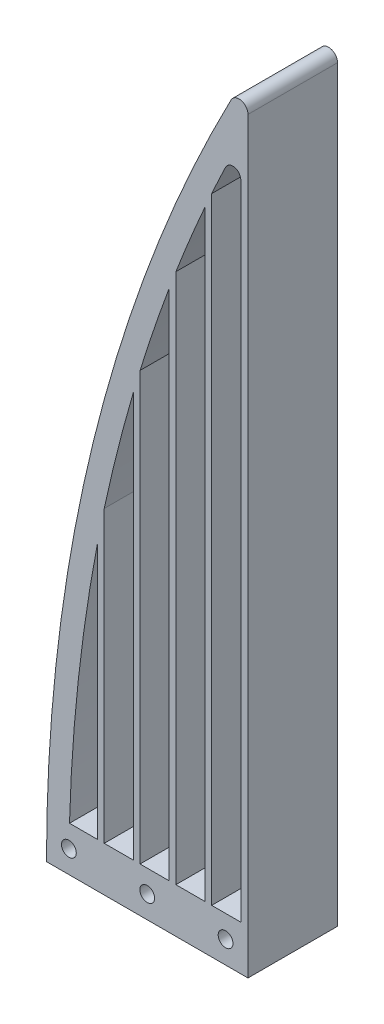
ISO-10303-21;
HEADER;
FILE_DESCRIPTION(('STEP AP214'),'2;1');
FILE_NAME('part.step','',(''),(''),'','','');
FILE_SCHEMA(('AUTOMOTIVE_DESIGN { 1 0 10303 214 1 1 1 1 }'));
ENDSEC;
DATA;
#1=APPLICATION_CONTEXT('core data for automotive mechanical design processes');
#2=APPLICATION_PROTOCOL_DEFINITION('international standard','automotive_design',2000,#1);
#3=PRODUCT_CONTEXT('',#1,'mechanical');
#4=PRODUCT('Part','Part','',(#3));
#5=PRODUCT_RELATED_PRODUCT_CATEGORY('part','',(#4));
#6=PRODUCT_DEFINITION_FORMATION('','',#4);
#7=PRODUCT_DEFINITION_CONTEXT('part definition',#1,'design');
#8=PRODUCT_DEFINITION('design','',#6,#7);
#9=PRODUCT_DEFINITION_SHAPE('','',#8);
#10=(LENGTH_UNIT() NAMED_UNIT(*) SI_UNIT(.MILLI.,.METRE.));
#11=(NAMED_UNIT(*) PLANE_ANGLE_UNIT() SI_UNIT($,.RADIAN.));
#12=(NAMED_UNIT(*) SI_UNIT($,.STERADIAN.) SOLID_ANGLE_UNIT());
#13=UNCERTAINTY_MEASURE_WITH_UNIT(LENGTH_MEASURE(1.E-05),#10,'distance_accuracy_value','');
#14=(GEOMETRIC_REPRESENTATION_CONTEXT(3) GLOBAL_UNCERTAINTY_ASSIGNED_CONTEXT((#13)) GLOBAL_UNIT_ASSIGNED_CONTEXT((#10,
#11,#12)) REPRESENTATION_CONTEXT('',''));
#15=CARTESIAN_POINT('',(0.,0.,0.));
#16=DIRECTION('',(0.,0.,1.));
#17=DIRECTION('',(1.,0.,0.));
#18=AXIS2_PLACEMENT_3D('',#15,#16,#17);
#19=CARTESIAN_POINT('',(317.777777777774,0.,20.));
#20=DIRECTION('',(0.,0.,1.));
#21=DIRECTION('',(1.,0.,0.));
#22=AXIS2_PLACEMENT_3D('',#19,#20,#21);
#23=PLANE('',#22);
#24=CARTESIAN_POINT('',(317.777777777774,0.,20.));
#25=DIRECTION('',(0.,0.,1.));
#26=DIRECTION('',(1.,0.,0.));
#27=AXIS2_PLACEMENT_3D('',#24,#25,#26);
#28=CIRCLE('',#27,357.777777777774);
#29=CARTESIAN_POINT('',(-33.6,67.3690994117891,20.));
#30=VERTEX_POINT('',#29);
#31=CARTESIAN_POINT('',(-39.8602211423662,10.,20.));
#32=VERTEX_POINT('',#31);
#33=EDGE_CURVE('E333',#30,#32,#28,.T.);
#34=ORIENTED_EDGE('',*,*,#33,.F.);
#35=DIRECTION('',(0.,-1.,0.));
#36=VECTOR('',#35,1.);
#37=CARTESIAN_POINT('',(-33.6,158.564445620495,20.));
#38=LINE('',#37,#36);
#39=CARTESIAN_POINT('',(-33.6,10.,20.));
#40=VERTEX_POINT('',#39);
#41=EDGE_CURVE('E230',#30,#40,#38,.T.);
#42=ORIENTED_EDGE('',*,*,#41,.T.);
#43=DIRECTION('',(1.,0.,0.));
#44=VECTOR('',#43,1.);
#45=CARTESIAN_POINT('',(-1.6,10.,20.));
#46=LINE('',#45,#44);
#47=EDGE_CURVE('E215',#32,#40,#46,.T.);
#48=ORIENTED_EDGE('',*,*,#47,.F.);
#49=EDGE_LOOP('',(#34,#42,#48));
#50=FACE_BOUND('',#49,.T.);
#51=DIRECTION('',(0.,1.,0.));
#52=VECTOR('',#51,1.);
#53=CARTESIAN_POINT('',(-32.1,158.564445620495,20.));
#54=LINE('',#53,#52);
#55=CARTESIAN_POINT('',(-32.1,10.,20.));
#56=VERTEX_POINT('',#55);
#57=CARTESIAN_POINT('',(-32.1,74.7695050731834,20.));
#58=VERTEX_POINT('',#57);
#59=EDGE_CURVE('E209',#56,#58,#54,.T.);
#60=ORIENTED_EDGE('',*,*,#59,.T.);
#61=CARTESIAN_POINT('',(-25.6,100.482038195888,20.));
#62=VERTEX_POINT('',#61);
#63=EDGE_CURVE('E543',#62,#58,#28,.T.);
#64=ORIENTED_EDGE('',*,*,#63,.F.);
#65=DIRECTION('',(0.,-1.,0.));
#66=VECTOR('',#65,1.);
#67=CARTESIAN_POINT('',(-25.6,158.564445620495,20.));
#68=LINE('',#67,#66);
#69=CARTESIAN_POINT('',(-25.6,10.,20.));
#70=VERTEX_POINT('',#69);
#71=EDGE_CURVE('E211',#62,#70,#68,.T.);
#72=ORIENTED_EDGE('',*,*,#71,.T.);
#73=EDGE_CURVE('E205',#56,#70,#46,.T.);
#74=ORIENTED_EDGE('',*,*,#73,.F.);
#75=EDGE_LOOP('',(#60,#64,#72,#74));
#76=FACE_BOUND('',#75,.T.);
#77=DIRECTION('',(0.,1.,0.));
#78=VECTOR('',#77,1.);
#79=CARTESIAN_POINT('',(-24.1,158.564445620495,20.));
#80=LINE('',#79,#78);
#81=CARTESIAN_POINT('',(-24.1,10.,20.));
#82=VERTEX_POINT('',#81);
#83=CARTESIAN_POINT('',(-24.1,105.472855907732,20.));
#84=VERTEX_POINT('',#83);
#85=EDGE_CURVE('E247',#82,#84,#80,.T.);
#86=ORIENTED_EDGE('',*,*,#85,.T.);
#87=CARTESIAN_POINT('',(-17.6,124.606117203146,20.));
#88=VERTEX_POINT('',#87);
#89=EDGE_CURVE('E522',#88,#84,#28,.T.);
#90=ORIENTED_EDGE('',*,*,#89,.F.);
#91=DIRECTION('',(0.,-1.,0.));
#92=VECTOR('',#91,1.);
#93=CARTESIAN_POINT('',(-17.6,158.564445620495,20.));
#94=LINE('',#93,#92);
#95=CARTESIAN_POINT('',(-17.6,10.,20.));
#96=VERTEX_POINT('',#95);
#97=EDGE_CURVE('E264',#88,#96,#94,.T.);
#98=ORIENTED_EDGE('',*,*,#97,.T.);
#99=EDGE_CURVE('E216',#82,#96,#46,.T.);
#100=ORIENTED_EDGE('',*,*,#99,.F.);
#101=EDGE_LOOP('',(#86,#90,#98,#100));
#102=FACE_BOUND('',#101,.T.);
#103=DIRECTION('',(0.,1.,0.));
#104=VECTOR('',#103,1.);
#105=CARTESIAN_POINT('',(-16.1,158.564445620495,20.));
#106=LINE('',#105,#104);
#107=CARTESIAN_POINT('',(-16.1,10.,20.));
#108=VERTEX_POINT('',#107);
#109=CARTESIAN_POINT('',(-16.1,128.571255643622,20.));
#110=VERTEX_POINT('',#109);
#111=EDGE_CURVE('E269',#108,#110,#106,.T.);
#112=ORIENTED_EDGE('',*,*,#111,.T.);
#113=CARTESIAN_POINT('',(-9.6,144.321616152566,20.));
#114=VERTEX_POINT('',#113);
#115=EDGE_CURVE('E337',#114,#110,#28,.T.);
#116=ORIENTED_EDGE('',*,*,#115,.F.);
#117=DIRECTION('',(0.,-1.,0.));
#118=VECTOR('',#117,1.);
#119=CARTESIAN_POINT('',(-9.59999999999999,158.564445620495,20.));
#120=LINE('',#119,#118);
#121=CARTESIAN_POINT('',(-9.59999999999999,10.,20.));
#122=VERTEX_POINT('',#121);
#123=EDGE_CURVE('E288',#114,#122,#120,.T.);
#124=ORIENTED_EDGE('',*,*,#123,.T.);
#125=EDGE_CURVE('E525',#108,#122,#46,.T.);
#126=ORIENTED_EDGE('',*,*,#125,.F.);
#127=EDGE_LOOP('',(#112,#116,#124,#126));
#128=FACE_BOUND('',#127,.T.);
#129=DIRECTION('',(0.,1.,0.));
#130=VECTOR('',#129,1.);
#131=CARTESIAN_POINT('',(-8.09999999999999,158.564445620495,20.));
#132=LINE('',#131,#130);
#133=CARTESIAN_POINT('',(-8.09999999999999,10.,20.));
#134=VERTEX_POINT('',#133);
#135=CARTESIAN_POINT('',(-8.1,147.677392386993,20.));
#136=VERTEX_POINT('',#135);
#137=EDGE_CURVE('E293',#134,#136,#132,.T.);
#138=ORIENTED_EDGE('',*,*,#137,.T.);
#139=CARTESIAN_POINT('',(-5.,154.335493145433,20.));
#140=VERTEX_POINT('',#139);
#141=EDGE_CURVE('E335',#140,#136,#28,.T.);
#142=ORIENTED_EDGE('',*,*,#141,.F.);
#143=CARTESIAN_POINT('',(-3.3874285714286,153.564445620495,20.));
#144=DIRECTION('',(0.,0.,1.));
#145=DIRECTION('',(1.,0.,0.));
#146=AXIS2_PLACEMENT_3D('',#143,#144,#145);
#147=CIRCLE('',#146,1.78742857142858);
#148=CARTESIAN_POINT('',(-1.6,153.564445620495,20.));
#149=VERTEX_POINT('',#148);
#150=EDGE_CURVE('E331',#149,#140,#147,.T.);
#151=ORIENTED_EDGE('',*,*,#150,.F.);
#152=DIRECTION('',(0.,1.,0.));
#153=VECTOR('',#152,1.);
#154=CARTESIAN_POINT('',(-1.6,10.,20.));
#155=LINE('',#154,#153);
#156=CARTESIAN_POINT('',(-1.59999999999999,10.,20.));
#157=VERTEX_POINT('',#156);
#158=EDGE_CURVE('E339',#157,#149,#155,.T.);
#159=ORIENTED_EDGE('',*,*,#158,.F.);
#160=EDGE_CURVE('E336',#134,#157,#46,.T.);
#161=ORIENTED_EDGE('',*,*,#160,.F.);
#162=EDGE_LOOP('',(#138,#142,#151,#159,#161));
#163=FACE_BOUND('',#162,.T.);
#164=CARTESIAN_POINT('',(-40.,5.,20.));
#165=DIRECTION('',(0.,0.,1.));
#166=DIRECTION('',(1.,0.,0.));
#167=AXIS2_PLACEMENT_3D('',#164,#165,#166);
#168=CIRCLE('',#167,1.65);
#169=CARTESIAN_POINT('',(-38.35,5.,20.));
#170=VERTEX_POINT('',#169);
#171=EDGE_CURVE('E317',#170,#170,#168,.T.);
#172=ORIENTED_EDGE('',*,*,#171,.F.);
#173=EDGE_LOOP('',(#172));
#174=FACE_BOUND('',#173,.T.);
#175=CARTESIAN_POINT('',(-22.5,5.,20.));
#176=DIRECTION('',(0.,0.,1.));
#177=DIRECTION('',(1.,0.,0.));
#178=AXIS2_PLACEMENT_3D('',#175,#176,#177);
#179=CIRCLE('',#178,1.65);
#180=CARTESIAN_POINT('',(-20.85,5.,20.));
#181=VERTEX_POINT('',#180);
#182=EDGE_CURVE('E320',#181,#181,#179,.T.);
#183=ORIENTED_EDGE('',*,*,#182,.F.);
#184=EDGE_LOOP('',(#183));
#185=FACE_BOUND('',#184,.T.);
#186=CARTESIAN_POINT('',(-5.,5.,20.));
#187=DIRECTION('',(0.,0.,1.));
#188=DIRECTION('',(1.,0.,0.));
#189=AXIS2_PLACEMENT_3D('',#186,#187,#188);
#190=CIRCLE('',#189,1.65);
#191=CARTESIAN_POINT('',(-3.35,5.,20.));
#192=VERTEX_POINT('',#191);
#193=EDGE_CURVE('E326',#192,#192,#190,.T.);
#194=ORIENTED_EDGE('',*,*,#193,.F.);
#195=EDGE_LOOP('',(#194));
#196=FACE_BOUND('',#195,.T.);
#197=CARTESIAN_POINT('',(317.777777777774,0.,20.));
#198=DIRECTION('',(0.,0.,1.));
#199=DIRECTION('',(1.,0.,0.));
#200=AXIS2_PLACEMENT_3D('',#197,#198,#199);
#201=CIRCLE('',#200,362.777777777774);
#202=CARTESIAN_POINT('',(-3.77271327379119,167.967252028118,20.));
#203=VERTEX_POINT('',#202);
#204=CARTESIAN_POINT('',(-45.,0.,20.));
#205=VERTEX_POINT('',#204);
#206=EDGE_CURVE('E365',#203,#205,#201,.T.);
#207=ORIENTED_EDGE('',*,*,#206,.T.);
#208=DIRECTION('',(1.,0.,0.));
#209=VECTOR('',#208,1.);
#210=CARTESIAN_POINT('',(-45.,0.,20.));
#211=LINE('',#210,#209);
#212=CARTESIAN_POINT('',(0.,0.,20.));
#213=VERTEX_POINT('',#212);
#214=EDGE_CURVE('E367',#205,#213,#211,.T.);
#215=ORIENTED_EDGE('',*,*,#214,.T.);
#216=DIRECTION('',(0.,1.,0.));
#217=VECTOR('',#216,1.);
#218=CARTESIAN_POINT('',(0.,0.,20.));
#219=LINE('',#218,#217);
#220=CARTESIAN_POINT('',(0.,167.041245738223,20.));
#221=VERTEX_POINT('',#220);
#222=EDGE_CURVE('E370',#213,#221,#219,.T.);
#223=ORIENTED_EDGE('',*,*,#222,.T.);
#224=CARTESIAN_POINT('',(-2.,167.041245738223,20.));
#225=DIRECTION('',(0.,0.,1.));
#226=DIRECTION('',(1.,0.,0.));
#227=AXIS2_PLACEMENT_3D('',#224,#225,#226);
#228=CIRCLE('',#227,2.);
#229=EDGE_CURVE('E372',#221,#203,#228,.T.);
#230=ORIENTED_EDGE('',*,*,#229,.T.);
#231=EDGE_LOOP('',(#207,#215,#223,#230));
#232=FACE_BOUND('',#231,.T.);
#233=ADVANCED_FACE('F43',(#50,#76,#102,#128,#163,#174,#185,#196,#232),#23,.T.);
#234=CARTESIAN_POINT('',(317.777777777774,0.,0.));
#235=DIRECTION('',(0.,0.,1.));
#236=DIRECTION('',(1.,0.,0.));
#237=AXIS2_PLACEMENT_3D('',#234,#235,#236);
#238=PLANE('',#237);
#239=DIRECTION('',(0.,-1.,0.));
#240=VECTOR('',#239,1.);
#241=CARTESIAN_POINT('',(-33.6,158.564445620495,0.));
#242=LINE('',#241,#240);
#243=CARTESIAN_POINT('',(-33.6,67.3690994117891,0.));
#244=VERTEX_POINT('',#243);
#245=CARTESIAN_POINT('',(-33.6,10.,0.));
#246=VERTEX_POINT('',#245);
#247=EDGE_CURVE('E229',#244,#246,#242,.T.);
#248=ORIENTED_EDGE('',*,*,#247,.F.);
#249=CARTESIAN_POINT('',(317.777777777774,0.,0.));
#250=DIRECTION('',(0.,0.,1.));
#251=DIRECTION('',(1.,0.,0.));
#252=AXIS2_PLACEMENT_3D('',#249,#250,#251);
#253=CIRCLE('',#252,357.777777777774);
#254=CARTESIAN_POINT('',(-39.8602211423662,10.,0.));
#255=VERTEX_POINT('',#254);
#256=EDGE_CURVE('E58',#244,#255,#253,.T.);
#257=ORIENTED_EDGE('',*,*,#256,.T.);
#258=DIRECTION('',(1.,0.,0.));
#259=VECTOR('',#258,1.);
#260=CARTESIAN_POINT('',(-1.6,10.,0.));
#261=LINE('',#260,#259);
#262=EDGE_CURVE('E349',#255,#246,#261,.T.);
#263=ORIENTED_EDGE('',*,*,#262,.T.);
#264=EDGE_LOOP('',(#248,#257,#263));
#265=FACE_BOUND('',#264,.T.);
#266=CARTESIAN_POINT('',(-25.6,100.482038195888,0.));
#267=VERTEX_POINT('',#266);
#268=CARTESIAN_POINT('',(-32.1,74.7695050731834,0.));
#269=VERTEX_POINT('',#268);
#270=EDGE_CURVE('E544',#267,#269,#253,.T.);
#271=ORIENTED_EDGE('',*,*,#270,.T.);
#272=DIRECTION('',(0.,1.,0.));
#273=VECTOR('',#272,1.);
#274=CARTESIAN_POINT('',(-32.1,158.564445620495,0.));
#275=LINE('',#274,#273);
#276=CARTESIAN_POINT('',(-32.1,10.,0.));
#277=VERTEX_POINT('',#276);
#278=EDGE_CURVE('E233',#277,#269,#275,.T.);
#279=ORIENTED_EDGE('',*,*,#278,.F.);
#280=CARTESIAN_POINT('',(-25.6,10.,0.));
#281=VERTEX_POINT('',#280);
#282=EDGE_CURVE('E221',#277,#281,#261,.T.);
#283=ORIENTED_EDGE('',*,*,#282,.T.);
#284=DIRECTION('',(0.,-1.,0.));
#285=VECTOR('',#284,1.);
#286=CARTESIAN_POINT('',(-25.6,158.564445620495,0.));
#287=LINE('',#286,#285);
#288=EDGE_CURVE('E243',#267,#281,#287,.T.);
#289=ORIENTED_EDGE('',*,*,#288,.F.);
#290=EDGE_LOOP('',(#271,#279,#283,#289));
#291=FACE_BOUND('',#290,.T.);
#292=CARTESIAN_POINT('',(-17.6,124.606117203146,0.));
#293=VERTEX_POINT('',#292);
#294=CARTESIAN_POINT('',(-24.1,105.472855907732,0.));
#295=VERTEX_POINT('',#294);
#296=EDGE_CURVE('E545',#293,#295,#253,.T.);
#297=ORIENTED_EDGE('',*,*,#296,.T.);
#298=DIRECTION('',(0.,1.,0.));
#299=VECTOR('',#298,1.);
#300=CARTESIAN_POINT('',(-24.1,158.564445620495,0.));
#301=LINE('',#300,#299);
#302=CARTESIAN_POINT('',(-24.1,10.,0.));
#303=VERTEX_POINT('',#302);
#304=EDGE_CURVE('E246',#303,#295,#301,.T.);
#305=ORIENTED_EDGE('',*,*,#304,.F.);
#306=CARTESIAN_POINT('',(-17.6,10.,0.));
#307=VERTEX_POINT('',#306);
#308=EDGE_CURVE('E517',#303,#307,#261,.T.);
#309=ORIENTED_EDGE('',*,*,#308,.T.);
#310=DIRECTION('',(0.,-1.,0.));
#311=VECTOR('',#310,1.);
#312=CARTESIAN_POINT('',(-17.6,158.564445620495,0.));
#313=LINE('',#312,#311);
#314=EDGE_CURVE('E265',#293,#307,#313,.T.);
#315=ORIENTED_EDGE('',*,*,#314,.F.);
#316=EDGE_LOOP('',(#297,#305,#309,#315));
#317=FACE_BOUND('',#316,.T.);
#318=CARTESIAN_POINT('',(-9.6,144.321616152566,0.));
#319=VERTEX_POINT('',#318);
#320=CARTESIAN_POINT('',(-16.1,128.571255643622,0.));
#321=VERTEX_POINT('',#320);
#322=EDGE_CURVE('E348',#319,#321,#253,.T.);
#323=ORIENTED_EDGE('',*,*,#322,.T.);
#324=DIRECTION('',(0.,1.,0.));
#325=VECTOR('',#324,1.);
#326=CARTESIAN_POINT('',(-16.1,158.564445620495,0.));
#327=LINE('',#326,#325);
#328=CARTESIAN_POINT('',(-16.1,10.,0.));
#329=VERTEX_POINT('',#328);
#330=EDGE_CURVE('E268',#329,#321,#327,.T.);
#331=ORIENTED_EDGE('',*,*,#330,.F.);
#332=CARTESIAN_POINT('',(-9.59999999999999,10.,0.));
#333=VERTEX_POINT('',#332);
#334=EDGE_CURVE('E453',#329,#333,#261,.T.);
#335=ORIENTED_EDGE('',*,*,#334,.T.);
#336=DIRECTION('',(0.,-1.,0.));
#337=VECTOR('',#336,1.);
#338=CARTESIAN_POINT('',(-9.59999999999999,158.564445620495,0.));
#339=LINE('',#338,#337);
#340=EDGE_CURVE('E289',#319,#333,#339,.T.);
#341=ORIENTED_EDGE('',*,*,#340,.F.);
#342=EDGE_LOOP('',(#323,#331,#335,#341));
#343=FACE_BOUND('',#342,.T.);
#344=CARTESIAN_POINT('',(-40.,5.,0.));
#345=DIRECTION('',(0.,0.,1.));
#346=DIRECTION('',(1.,0.,0.));
#347=AXIS2_PLACEMENT_3D('',#344,#345,#346);
#348=CIRCLE('',#347,1.65);
#349=CARTESIAN_POINT('',(-38.35,5.,0.));
#350=VERTEX_POINT('',#349);
#351=EDGE_CURVE('E313',#350,#350,#348,.T.);
#352=ORIENTED_EDGE('',*,*,#351,.T.);
#353=EDGE_LOOP('',(#352));
#354=FACE_BOUND('',#353,.T.);
#355=CARTESIAN_POINT('',(-22.5,5.,0.));
#356=DIRECTION('',(0.,0.,1.));
#357=DIRECTION('',(1.,0.,0.));
#358=AXIS2_PLACEMENT_3D('',#355,#356,#357);
#359=CIRCLE('',#358,1.65);
#360=CARTESIAN_POINT('',(-20.85,5.,0.));
#361=VERTEX_POINT('',#360);
#362=EDGE_CURVE('E323',#361,#361,#359,.T.);
#363=ORIENTED_EDGE('',*,*,#362,.T.);
#364=EDGE_LOOP('',(#363));
#365=FACE_BOUND('',#364,.T.);
#366=CARTESIAN_POINT('',(-5.,5.,0.));
#367=DIRECTION('',(0.,0.,1.));
#368=DIRECTION('',(1.,0.,0.));
#369=AXIS2_PLACEMENT_3D('',#366,#367,#368);
#370=CIRCLE('',#369,1.65);
#371=CARTESIAN_POINT('',(-3.35,5.,0.));
#372=VERTEX_POINT('',#371);
#373=EDGE_CURVE('E312',#372,#372,#370,.T.);
#374=ORIENTED_EDGE('',*,*,#373,.T.);
#375=EDGE_LOOP('',(#374));
#376=FACE_BOUND('',#375,.T.);
#377=CARTESIAN_POINT('',(-5.,154.335493145433,0.));
#378=VERTEX_POINT('',#377);
#379=CARTESIAN_POINT('',(-8.1,147.677392386993,0.));
#380=VERTEX_POINT('',#379);
#381=EDGE_CURVE('E344',#378,#380,#253,.T.);
#382=ORIENTED_EDGE('',*,*,#381,.T.);
#383=DIRECTION('',(0.,1.,0.));
#384=VECTOR('',#383,1.);
#385=CARTESIAN_POINT('',(-8.09999999999999,158.564445620495,0.));
#386=LINE('',#385,#384);
#387=CARTESIAN_POINT('',(-8.09999999999999,10.,0.));
#388=VERTEX_POINT('',#387);
#389=EDGE_CURVE('E292',#388,#380,#386,.T.);
#390=ORIENTED_EDGE('',*,*,#389,.F.);
#391=CARTESIAN_POINT('',(-1.6,10.,0.));
#392=VERTEX_POINT('',#391);
#393=EDGE_CURVE('E347',#388,#392,#261,.T.);
#394=ORIENTED_EDGE('',*,*,#393,.T.);
#395=DIRECTION('',(0.,1.,0.));
#396=VECTOR('',#395,1.);
#397=CARTESIAN_POINT('',(-1.6,10.,0.));
#398=LINE('',#397,#396);
#399=CARTESIAN_POINT('',(-1.59999999999999,153.564445620495,0.));
#400=VERTEX_POINT('',#399);
#401=EDGE_CURVE('E334',#392,#400,#398,.T.);
#402=ORIENTED_EDGE('',*,*,#401,.T.);
#403=CARTESIAN_POINT('',(-3.3874285714286,153.564445620495,0.));
#404=DIRECTION('',(0.,0.,1.));
#405=DIRECTION('',(1.,0.,0.));
#406=AXIS2_PLACEMENT_3D('',#403,#404,#405);
#407=CIRCLE('',#406,1.78742857142858);
#408=EDGE_CURVE('E316',#400,#378,#407,.T.);
#409=ORIENTED_EDGE('',*,*,#408,.T.);
#410=EDGE_LOOP('',(#382,#390,#394,#402,#409));
#411=FACE_BOUND('',#410,.T.);
#412=DIRECTION('',(1.,0.,0.));
#413=VECTOR('',#412,1.);
#414=CARTESIAN_POINT('',(-45.,0.,0.));
#415=LINE('',#414,#413);
#416=CARTESIAN_POINT('',(-45.,0.,0.));
#417=VERTEX_POINT('',#416);
#418=CARTESIAN_POINT('',(0.,0.,0.));
#419=VERTEX_POINT('',#418);
#420=EDGE_CURVE('E376',#417,#419,#415,.T.);
#421=ORIENTED_EDGE('',*,*,#420,.F.);
#422=CARTESIAN_POINT('',(317.777777777774,0.,0.));
#423=DIRECTION('',(0.,0.,1.));
#424=DIRECTION('',(1.,0.,0.));
#425=AXIS2_PLACEMENT_3D('',#422,#423,#424);
#426=CIRCLE('',#425,362.777777777774);
#427=CARTESIAN_POINT('',(-3.77271327379119,167.967252028118,0.));
#428=VERTEX_POINT('',#427);
#429=EDGE_CURVE('E364',#428,#417,#426,.T.);
#430=ORIENTED_EDGE('',*,*,#429,.F.);
#431=CARTESIAN_POINT('',(-2.,167.041245738223,0.));
#432=DIRECTION('',(0.,0.,1.));
#433=DIRECTION('',(1.,0.,0.));
#434=AXIS2_PLACEMENT_3D('',#431,#432,#433);
#435=CIRCLE('',#434,2.);
#436=CARTESIAN_POINT('',(0.,167.041245738223,0.));
#437=VERTEX_POINT('',#436);
#438=EDGE_CURVE('E368',#437,#428,#435,.T.);
#439=ORIENTED_EDGE('',*,*,#438,.F.);
#440=DIRECTION('',(0.,1.,0.));
#441=VECTOR('',#440,1.);
#442=CARTESIAN_POINT('',(0.,0.,0.));
#443=LINE('',#442,#441);
#444=EDGE_CURVE('E378',#419,#437,#443,.T.);
#445=ORIENTED_EDGE('',*,*,#444,.F.);
#446=EDGE_LOOP('',(#421,#430,#439,#445));
#447=FACE_BOUND('',#446,.T.);
#448=ADVANCED_FACE('F397',(#265,#291,#317,#343,#354,#365,#376,#411,#447),#238,.F.);
#449=CARTESIAN_POINT('',(317.777777777774,0.,20.));
#450=DIRECTION('',(0.,0.,-1.));
#451=DIRECTION('',(-1.,0.,0.));
#452=AXIS2_PLACEMENT_3D('',#449,#450,#451);
#453=CYLINDRICAL_SURFACE('',#452,357.777777777774);
#454=DIRECTION('',(0.,0.,-1.));
#455=VECTOR('',#454,1.);
#456=CARTESIAN_POINT('',(-32.1,74.7695050731834,20.));
#457=LINE('',#456,#455);
#458=EDGE_CURVE('E66',#269,#58,#457,.F.);
#459=ORIENTED_EDGE('',*,*,#458,.F.);
#460=ORIENTED_EDGE('',*,*,#270,.F.);
#461=DIRECTION('',(0.,0.,-1.));
#462=VECTOR('',#461,1.);
#463=CARTESIAN_POINT('',(-25.6,100.482038195888,20.));
#464=LINE('',#463,#462);
#465=EDGE_CURVE('E257',#62,#267,#464,.T.);
#466=ORIENTED_EDGE('',*,*,#465,.F.);
#467=ORIENTED_EDGE('',*,*,#63,.T.);
#468=EDGE_LOOP('',(#459,#460,#466,#467));
#469=FACE_BOUND('',#468,.T.);
#470=ADVANCED_FACE('F422',(#469),#453,.F.);
#471=CARTESIAN_POINT('',(-1.6,10.,20.));
#472=DIRECTION('',(0.,1.,0.));
#473=DIRECTION('',(-1.,0.,0.));
#474=AXIS2_PLACEMENT_3D('',#471,#472,#473);
#475=PLANE('',#474);
#476=DIRECTION('',(0.,0.,1.));
#477=VECTOR('',#476,1.);
#478=CARTESIAN_POINT('',(-32.1,10.,0.));
#479=LINE('',#478,#477);
#480=EDGE_CURVE('E219',#277,#56,#479,.T.);
#481=ORIENTED_EDGE('',*,*,#480,.T.);
#482=ORIENTED_EDGE('',*,*,#73,.T.);
#483=DIRECTION('',(0.,0.,1.));
#484=VECTOR('',#483,1.);
#485=CARTESIAN_POINT('',(-25.6,10.,0.));
#486=LINE('',#485,#484);
#487=EDGE_CURVE('E250',#281,#70,#486,.T.);
#488=ORIENTED_EDGE('',*,*,#487,.F.);
#489=ORIENTED_EDGE('',*,*,#282,.F.);
#490=EDGE_LOOP('',(#481,#482,#488,#489));
#491=FACE_BOUND('',#490,.T.);
#492=ADVANCED_FACE('F220',(#491),#475,.T.);
#493=DIRECTION('',(0.,0.,-1.));
#494=VECTOR('',#493,1.);
#495=CARTESIAN_POINT('',(-24.1,105.472855907732,20.));
#496=LINE('',#495,#494);
#497=EDGE_CURVE('E261',#295,#84,#496,.F.);
#498=ORIENTED_EDGE('',*,*,#497,.F.);
#499=ORIENTED_EDGE('',*,*,#296,.F.);
#500=DIRECTION('',(0.,0.,-1.));
#501=VECTOR('',#500,1.);
#502=CARTESIAN_POINT('',(-17.6,124.606117203146,20.));
#503=LINE('',#502,#501);
#504=EDGE_CURVE('E280',#88,#293,#503,.T.);
#505=ORIENTED_EDGE('',*,*,#504,.F.);
#506=ORIENTED_EDGE('',*,*,#89,.T.);
#507=EDGE_LOOP('',(#498,#499,#505,#506));
#508=FACE_BOUND('',#507,.T.);
#509=ADVANCED_FACE('F494',(#508),#453,.F.);
#510=DIRECTION('',(0.,0.,1.));
#511=VECTOR('',#510,1.);
#512=CARTESIAN_POINT('',(-24.1,10.,0.));
#513=LINE('',#512,#511);
#514=EDGE_CURVE('E254',#303,#82,#513,.T.);
#515=ORIENTED_EDGE('',*,*,#514,.T.);
#516=ORIENTED_EDGE('',*,*,#99,.T.);
#517=DIRECTION('',(0.,0.,1.));
#518=VECTOR('',#517,1.);
#519=CARTESIAN_POINT('',(-17.6,10.,0.));
#520=LINE('',#519,#518);
#521=EDGE_CURVE('E272',#307,#96,#520,.T.);
#522=ORIENTED_EDGE('',*,*,#521,.F.);
#523=ORIENTED_EDGE('',*,*,#308,.F.);
#524=EDGE_LOOP('',(#515,#516,#522,#523));
#525=FACE_BOUND('',#524,.T.);
#526=ADVANCED_FACE('F495',(#525),#475,.T.);
#527=DIRECTION('',(0.,0.,-1.));
#528=VECTOR('',#527,1.);
#529=CARTESIAN_POINT('',(-16.1,128.571255643622,20.));
#530=LINE('',#529,#528);
#531=EDGE_CURVE('E285',#321,#110,#530,.F.);
#532=ORIENTED_EDGE('',*,*,#531,.F.);
#533=ORIENTED_EDGE('',*,*,#322,.F.);
#534=DIRECTION('',(0.,0.,-1.));
#535=VECTOR('',#534,1.);
#536=CARTESIAN_POINT('',(-9.6,144.321616152566,20.));
#537=LINE('',#536,#535);
#538=EDGE_CURVE('E304',#114,#319,#537,.T.);
#539=ORIENTED_EDGE('',*,*,#538,.F.);
#540=ORIENTED_EDGE('',*,*,#115,.T.);
#541=EDGE_LOOP('',(#532,#533,#539,#540));
#542=FACE_BOUND('',#541,.T.);
#543=ADVANCED_FACE('F501',(#542),#453,.F.);
#544=DIRECTION('',(0.,0.,1.));
#545=VECTOR('',#544,1.);
#546=CARTESIAN_POINT('',(-16.1,10.,0.));
#547=LINE('',#546,#545);
#548=EDGE_CURVE('E277',#329,#108,#547,.T.);
#549=ORIENTED_EDGE('',*,*,#548,.T.);
#550=ORIENTED_EDGE('',*,*,#125,.T.);
#551=DIRECTION('',(0.,0.,1.));
#552=VECTOR('',#551,1.);
#553=CARTESIAN_POINT('',(-9.59999999999999,10.,0.));
#554=LINE('',#553,#552);
#555=EDGE_CURVE('E296',#333,#122,#554,.T.);
#556=ORIENTED_EDGE('',*,*,#555,.F.);
#557=ORIENTED_EDGE('',*,*,#334,.F.);
#558=EDGE_LOOP('',(#549,#550,#556,#557));
#559=FACE_BOUND('',#558,.T.);
#560=ADVANCED_FACE('F497',(#559),#475,.T.);
#561=DIRECTION('',(0.,0.,-1.));
#562=VECTOR('',#561,1.);
#563=CARTESIAN_POINT('',(-8.1,147.677392386993,20.));
#564=LINE('',#563,#562);
#565=EDGE_CURVE('E309',#380,#136,#564,.F.);
#566=ORIENTED_EDGE('',*,*,#565,.F.);
#567=ORIENTED_EDGE('',*,*,#381,.F.);
#568=DIRECTION('',(0.,0.,-1.));
#569=VECTOR('',#568,1.);
#570=CARTESIAN_POINT('',(-5.,154.335493145433,20.));
#571=LINE('',#570,#569);
#572=EDGE_CURVE('E361',#140,#378,#571,.T.);
#573=ORIENTED_EDGE('',*,*,#572,.F.);
#574=ORIENTED_EDGE('',*,*,#141,.T.);
#575=EDGE_LOOP('',(#566,#567,#573,#574));
#576=FACE_BOUND('',#575,.T.);
#577=ADVANCED_FACE('F440',(#576),#453,.F.);
#578=DIRECTION('',(0.,0.,1.));
#579=VECTOR('',#578,1.);
#580=CARTESIAN_POINT('',(-8.09999999999999,10.,0.));
#581=LINE('',#580,#579);
#582=EDGE_CURVE('E301',#388,#134,#581,.T.);
#583=ORIENTED_EDGE('',*,*,#582,.T.);
#584=ORIENTED_EDGE('',*,*,#160,.T.);
#585=DIRECTION('',(0.,0.,-1.));
#586=VECTOR('',#585,1.);
#587=CARTESIAN_POINT('',(-1.6,10.,20.));
#588=LINE('',#587,#586);
#589=EDGE_CURVE('E356',#157,#392,#588,.T.);
#590=ORIENTED_EDGE('',*,*,#589,.T.);
#591=ORIENTED_EDGE('',*,*,#393,.F.);
#592=EDGE_LOOP('',(#583,#584,#590,#591));
#593=FACE_BOUND('',#592,.T.);
#594=ADVANCED_FACE('F414',(#593),#475,.T.);
#595=CARTESIAN_POINT('',(317.777777777774,0.,20.));
#596=DIRECTION('',(0.,0.,-1.));
#597=DIRECTION('',(-1.,0.,0.));
#598=AXIS2_PLACEMENT_3D('',#595,#596,#597);
#599=CYLINDRICAL_SURFACE('',#598,362.777777777774);
#600=DIRECTION('',(0.,0.,-1.));
#601=VECTOR('',#600,1.);
#602=CARTESIAN_POINT('',(-45.,0.,20.));
#603=LINE('',#602,#601);
#604=EDGE_CURVE('E11',#205,#417,#603,.T.);
#605=ORIENTED_EDGE('',*,*,#604,.F.);
#606=ORIENTED_EDGE('',*,*,#206,.F.);
#607=DIRECTION('',(0.,0.,-1.));
#608=VECTOR('',#607,1.);
#609=CARTESIAN_POINT('',(-3.77271327379119,167.967252028118,20.));
#610=LINE('',#609,#608);
#611=EDGE_CURVE('E374',#203,#428,#610,.T.);
#612=ORIENTED_EDGE('',*,*,#611,.T.);
#613=ORIENTED_EDGE('',*,*,#429,.T.);
#614=EDGE_LOOP('',(#605,#606,#612,#613));
#615=FACE_BOUND('',#614,.T.);
#616=ADVANCED_FACE('F45',(#615),#599,.T.);
#617=CARTESIAN_POINT('',(-45.,0.,20.));
#618=DIRECTION('',(0.,1.,0.));
#619=DIRECTION('',(0.,0.,1.));
#620=AXIS2_PLACEMENT_3D('',#617,#618,#619);
#621=PLANE('',#620);
#622=ORIENTED_EDGE('',*,*,#420,.T.);
#623=DIRECTION('',(0.,0.,-1.));
#624=VECTOR('',#623,1.);
#625=CARTESIAN_POINT('',(0.,0.,20.));
#626=LINE('',#625,#624);
#627=EDGE_CURVE('E51',#213,#419,#626,.T.);
#628=ORIENTED_EDGE('',*,*,#627,.F.);
#629=ORIENTED_EDGE('',*,*,#214,.F.);
#630=ORIENTED_EDGE('',*,*,#604,.T.);
#631=EDGE_LOOP('',(#622,#628,#629,#630));
#632=FACE_BOUND('',#631,.T.);
#633=ADVANCED_FACE('F407',(#632),#621,.F.);
#634=CARTESIAN_POINT('',(0.,0.,20.));
#635=DIRECTION('',(-1.,0.,0.));
#636=DIRECTION('',(0.,0.,1.));
#637=AXIS2_PLACEMENT_3D('',#634,#635,#636);
#638=PLANE('',#637);
#639=ORIENTED_EDGE('',*,*,#444,.T.);
#640=DIRECTION('',(0.,0.,-1.));
#641=VECTOR('',#640,1.);
#642=CARTESIAN_POINT('',(0.,167.041245738223,20.));
#643=LINE('',#642,#641);
#644=EDGE_CURVE('E383',#221,#437,#643,.T.);
#645=ORIENTED_EDGE('',*,*,#644,.F.);
#646=ORIENTED_EDGE('',*,*,#222,.F.);
#647=ORIENTED_EDGE('',*,*,#627,.T.);
#648=EDGE_LOOP('',(#639,#645,#646,#647));
#649=FACE_BOUND('',#648,.T.);
#650=ADVANCED_FACE('F390',(#649),#638,.F.);
#651=CARTESIAN_POINT('',(-2.,167.041245738223,20.));
#652=DIRECTION('',(0.,0.,-1.));
#653=DIRECTION('',(-1.,0.,0.));
#654=AXIS2_PLACEMENT_3D('',#651,#652,#653);
#655=CYLINDRICAL_SURFACE('',#654,2.);
#656=ORIENTED_EDGE('',*,*,#438,.T.);
#657=ORIENTED_EDGE('',*,*,#611,.F.);
#658=ORIENTED_EDGE('',*,*,#229,.F.);
#659=ORIENTED_EDGE('',*,*,#644,.T.);
#660=EDGE_LOOP('',(#656,#657,#658,#659));
#661=FACE_BOUND('',#660,.T.);
#662=ADVANCED_FACE('F401',(#661),#655,.T.);
#663=CARTESIAN_POINT('',(-3.3874285714286,153.564445620495,20.));
#664=DIRECTION('',(0.,0.,-1.));
#665=DIRECTION('',(-1.,0.,0.));
#666=AXIS2_PLACEMENT_3D('',#663,#664,#665);
#667=CYLINDRICAL_SURFACE('',#666,1.78742857142858);
#668=ORIENTED_EDGE('',*,*,#408,.F.);
#669=DIRECTION('',(0.,0.,-1.));
#670=VECTOR('',#669,1.);
#671=CARTESIAN_POINT('',(-1.6,153.564445620495,20.));
#672=LINE('',#671,#670);
#673=EDGE_CURVE('E341',#149,#400,#672,.T.);
#674=ORIENTED_EDGE('',*,*,#673,.F.);
#675=ORIENTED_EDGE('',*,*,#150,.T.);
#676=ORIENTED_EDGE('',*,*,#572,.T.);
#677=EDGE_LOOP('',(#668,#674,#675,#676));
#678=FACE_BOUND('',#677,.T.);
#679=ADVANCED_FACE('F426',(#678),#667,.F.);
#680=DIRECTION('',(0.,0.,-1.));
#681=VECTOR('',#680,1.);
#682=CARTESIAN_POINT('',(-33.6,67.3690994117891,20.));
#683=LINE('',#682,#681);
#684=EDGE_CURVE('E225',#30,#244,#683,.T.);
#685=ORIENTED_EDGE('',*,*,#684,.F.);
#686=ORIENTED_EDGE('',*,*,#33,.T.);
#687=DIRECTION('',(0.,0.,-1.));
#688=VECTOR('',#687,1.);
#689=CARTESIAN_POINT('',(-39.8602211423662,10.,20.));
#690=LINE('',#689,#688);
#691=EDGE_CURVE('E359',#32,#255,#690,.T.);
#692=ORIENTED_EDGE('',*,*,#691,.T.);
#693=ORIENTED_EDGE('',*,*,#256,.F.);
#694=EDGE_LOOP('',(#685,#686,#692,#693));
#695=FACE_BOUND('',#694,.T.);
#696=ADVANCED_FACE('F433',(#695),#453,.F.);
#697=DIRECTION('',(0.,0.,1.));
#698=VECTOR('',#697,1.);
#699=CARTESIAN_POINT('',(-33.6,10.,0.));
#700=LINE('',#699,#698);
#701=EDGE_CURVE('E226',#246,#40,#700,.T.);
#702=ORIENTED_EDGE('',*,*,#701,.F.);
#703=ORIENTED_EDGE('',*,*,#262,.F.);
#704=ORIENTED_EDGE('',*,*,#691,.F.);
#705=ORIENTED_EDGE('',*,*,#47,.T.);
#706=EDGE_LOOP('',(#702,#703,#704,#705));
#707=FACE_BOUND('',#706,.T.);
#708=ADVANCED_FACE('F439',(#707),#475,.T.);
#709=CARTESIAN_POINT('',(-1.6,10.,20.));
#710=DIRECTION('',(-1.,0.,0.));
#711=DIRECTION('',(0.,0.,1.));
#712=AXIS2_PLACEMENT_3D('',#709,#710,#711);
#713=PLANE('',#712);
#714=ORIENTED_EDGE('',*,*,#401,.F.);
#715=ORIENTED_EDGE('',*,*,#589,.F.);
#716=ORIENTED_EDGE('',*,*,#158,.T.);
#717=ORIENTED_EDGE('',*,*,#673,.T.);
#718=EDGE_LOOP('',(#714,#715,#716,#717));
#719=FACE_BOUND('',#718,.T.);
#720=ADVANCED_FACE('F447',(#719),#713,.T.);
#721=CARTESIAN_POINT('',(-5.,5.,0.));
#722=DIRECTION('',(0.,0.,1.));
#723=DIRECTION('',(1.,0.,0.));
#724=AXIS2_PLACEMENT_3D('',#721,#722,#723);
#725=CYLINDRICAL_SURFACE('',#724,1.65);
#726=ORIENTED_EDGE('',*,*,#373,.F.);
#727=EDGE_LOOP('',(#726));
#728=FACE_BOUND('',#727,.T.);
#729=ORIENTED_EDGE('',*,*,#193,.T.);
#730=EDGE_LOOP('',(#729));
#731=FACE_BOUND('',#730,.T.);
#732=ADVANCED_FACE('F483',(#728,#731),#725,.F.);
#733=CARTESIAN_POINT('',(-22.5,5.,0.));
#734=DIRECTION('',(0.,0.,1.));
#735=DIRECTION('',(1.,0.,0.));
#736=AXIS2_PLACEMENT_3D('',#733,#734,#735);
#737=CYLINDRICAL_SURFACE('',#736,1.65);
#738=ORIENTED_EDGE('',*,*,#362,.F.);
#739=EDGE_LOOP('',(#738));
#740=FACE_BOUND('',#739,.T.);
#741=ORIENTED_EDGE('',*,*,#182,.T.);
#742=EDGE_LOOP('',(#741));
#743=FACE_BOUND('',#742,.T.);
#744=ADVANCED_FACE('F479',(#740,#743),#737,.F.);
#745=CARTESIAN_POINT('',(-40.,5.,0.));
#746=DIRECTION('',(0.,0.,1.));
#747=DIRECTION('',(1.,0.,0.));
#748=AXIS2_PLACEMENT_3D('',#745,#746,#747);
#749=CYLINDRICAL_SURFACE('',#748,1.65);
#750=ORIENTED_EDGE('',*,*,#351,.F.);
#751=EDGE_LOOP('',(#750));
#752=FACE_BOUND('',#751,.T.);
#753=ORIENTED_EDGE('',*,*,#171,.T.);
#754=EDGE_LOOP('',(#753));
#755=FACE_BOUND('',#754,.T.);
#756=ADVANCED_FACE('F472',(#752,#755),#749,.F.);
#757=CARTESIAN_POINT('',(-9.59999999999999,158.564445620495,0.));
#758=DIRECTION('',(-1.,0.,0.));
#759=DIRECTION('',(0.,0.,1.));
#760=AXIS2_PLACEMENT_3D('',#757,#758,#759);
#761=PLANE('',#760);
#762=ORIENTED_EDGE('',*,*,#123,.F.);
#763=ORIENTED_EDGE('',*,*,#538,.T.);
#764=ORIENTED_EDGE('',*,*,#340,.T.);
#765=ORIENTED_EDGE('',*,*,#555,.T.);
#766=EDGE_LOOP('',(#762,#763,#764,#765));
#767=FACE_BOUND('',#766,.T.);
#768=ADVANCED_FACE('F463',(#767),#761,.T.);
#769=CARTESIAN_POINT('',(-8.09999999999999,158.564445620495,0.));
#770=DIRECTION('',(1.,0.,0.));
#771=DIRECTION('',(0.,0.,-1.));
#772=AXIS2_PLACEMENT_3D('',#769,#770,#771);
#773=PLANE('',#772);
#774=ORIENTED_EDGE('',*,*,#389,.T.);
#775=ORIENTED_EDGE('',*,*,#565,.T.);
#776=ORIENTED_EDGE('',*,*,#137,.F.);
#777=ORIENTED_EDGE('',*,*,#582,.F.);
#778=EDGE_LOOP('',(#774,#775,#776,#777));
#779=FACE_BOUND('',#778,.T.);
#780=ADVANCED_FACE('F459',(#779),#773,.T.);
#781=CARTESIAN_POINT('',(-17.6,158.564445620495,0.));
#782=DIRECTION('',(-1.,0.,0.));
#783=DIRECTION('',(0.,0.,1.));
#784=AXIS2_PLACEMENT_3D('',#781,#782,#783);
#785=PLANE('',#784);
#786=ORIENTED_EDGE('',*,*,#97,.F.);
#787=ORIENTED_EDGE('',*,*,#504,.T.);
#788=ORIENTED_EDGE('',*,*,#314,.T.);
#789=ORIENTED_EDGE('',*,*,#521,.T.);
#790=EDGE_LOOP('',(#786,#787,#788,#789));
#791=FACE_BOUND('',#790,.T.);
#792=ADVANCED_FACE('F462',(#791),#785,.T.);
#793=CARTESIAN_POINT('',(-16.1,158.564445620495,0.));
#794=DIRECTION('',(1.,0.,0.));
#795=DIRECTION('',(0.,0.,-1.));
#796=AXIS2_PLACEMENT_3D('',#793,#794,#795);
#797=PLANE('',#796);
#798=ORIENTED_EDGE('',*,*,#330,.T.);
#799=ORIENTED_EDGE('',*,*,#531,.T.);
#800=ORIENTED_EDGE('',*,*,#111,.F.);
#801=ORIENTED_EDGE('',*,*,#548,.F.);
#802=EDGE_LOOP('',(#798,#799,#800,#801));
#803=FACE_BOUND('',#802,.T.);
#804=ADVANCED_FACE('F469',(#803),#797,.T.);
#805=CARTESIAN_POINT('',(-25.6,158.564445620495,0.));
#806=DIRECTION('',(-1.,0.,0.));
#807=DIRECTION('',(0.,0.,1.));
#808=AXIS2_PLACEMENT_3D('',#805,#806,#807);
#809=PLANE('',#808);
#810=ORIENTED_EDGE('',*,*,#71,.F.);
#811=ORIENTED_EDGE('',*,*,#465,.T.);
#812=ORIENTED_EDGE('',*,*,#288,.T.);
#813=ORIENTED_EDGE('',*,*,#487,.T.);
#814=EDGE_LOOP('',(#810,#811,#812,#813));
#815=FACE_BOUND('',#814,.T.);
#816=ADVANCED_FACE('F541',(#815),#809,.T.);
#817=CARTESIAN_POINT('',(-24.1,158.564445620495,0.));
#818=DIRECTION('',(1.,0.,0.));
#819=DIRECTION('',(0.,0.,-1.));
#820=AXIS2_PLACEMENT_3D('',#817,#818,#819);
#821=PLANE('',#820);
#822=ORIENTED_EDGE('',*,*,#304,.T.);
#823=ORIENTED_EDGE('',*,*,#497,.T.);
#824=ORIENTED_EDGE('',*,*,#85,.F.);
#825=ORIENTED_EDGE('',*,*,#514,.F.);
#826=EDGE_LOOP('',(#822,#823,#824,#825));
#827=FACE_BOUND('',#826,.T.);
#828=ADVANCED_FACE('F520',(#827),#821,.T.);
#829=CARTESIAN_POINT('',(-33.6,158.564445620495,0.));
#830=DIRECTION('',(-1.,0.,0.));
#831=DIRECTION('',(0.,0.,1.));
#832=AXIS2_PLACEMENT_3D('',#829,#830,#831);
#833=PLANE('',#832);
#834=ORIENTED_EDGE('',*,*,#41,.F.);
#835=ORIENTED_EDGE('',*,*,#684,.T.);
#836=ORIENTED_EDGE('',*,*,#247,.T.);
#837=ORIENTED_EDGE('',*,*,#701,.T.);
#838=EDGE_LOOP('',(#834,#835,#836,#837));
#839=FACE_BOUND('',#838,.T.);
#840=ADVANCED_FACE('F553',(#839),#833,.T.);
#841=CARTESIAN_POINT('',(-32.1,158.564445620495,0.));
#842=DIRECTION('',(1.,0.,0.));
#843=DIRECTION('',(0.,0.,-1.));
#844=AXIS2_PLACEMENT_3D('',#841,#842,#843);
#845=PLANE('',#844);
#846=ORIENTED_EDGE('',*,*,#278,.T.);
#847=ORIENTED_EDGE('',*,*,#458,.T.);
#848=ORIENTED_EDGE('',*,*,#59,.F.);
#849=ORIENTED_EDGE('',*,*,#480,.F.);
#850=EDGE_LOOP('',(#846,#847,#848,#849));
#851=FACE_BOUND('',#850,.T.);
#852=ADVANCED_FACE('F228',(#851),#845,.T.);
#853=CLOSED_SHELL('',(#233,#448,#470,#492,#509,#526,#543,#560,#577,#594,#616,#633,#650,#662,
#679,#696,#708,#720,#732,#744,#756,#768,#780,#792,#804,#816,#828,#840,#852));
#854=MANIFOLD_SOLID_BREP('B2',#853);
#855=ADVANCED_BREP_SHAPE_REPRESENTATION('',(#18,#854),#14);
#856=SHAPE_DEFINITION_REPRESENTATION(#9,#855);
ENDSEC;
END-ISO-10303-21;
